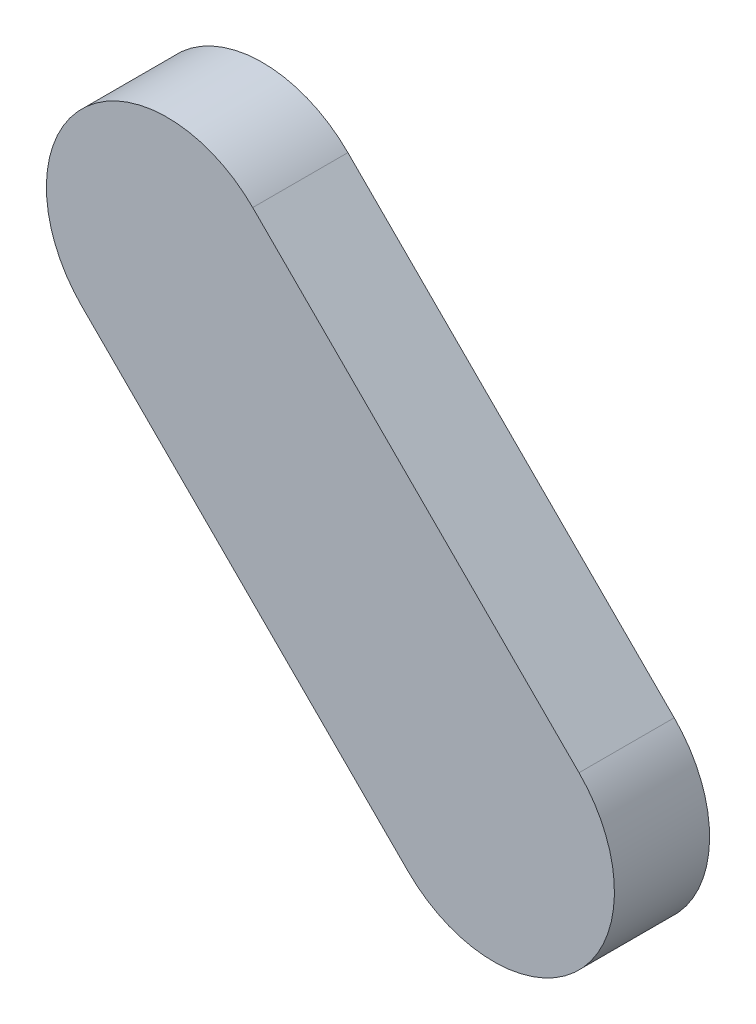
ISO-10303-21;
HEADER;
FILE_DESCRIPTION(('STEP AP214'),'2;1');
FILE_NAME('part.step','',(''),(''),'','','');
FILE_SCHEMA(('AUTOMOTIVE_DESIGN { 1 0 10303 214 1 1 1 1 }'));
ENDSEC;
DATA;
#1=APPLICATION_CONTEXT('core data for automotive mechanical design processes');
#2=APPLICATION_PROTOCOL_DEFINITION('international standard','automotive_design',2000,#1);
#3=PRODUCT_CONTEXT('',#1,'mechanical');
#4=PRODUCT('Part','Part','',(#3));
#5=PRODUCT_RELATED_PRODUCT_CATEGORY('part','',(#4));
#6=PRODUCT_DEFINITION_FORMATION('','',#4);
#7=PRODUCT_DEFINITION_CONTEXT('part definition',#1,'design');
#8=PRODUCT_DEFINITION('design','',#6,#7);
#9=PRODUCT_DEFINITION_SHAPE('','',#8);
#10=(LENGTH_UNIT() NAMED_UNIT(*) SI_UNIT(.MILLI.,.METRE.));
#11=(NAMED_UNIT(*) PLANE_ANGLE_UNIT() SI_UNIT($,.RADIAN.));
#12=(NAMED_UNIT(*) SI_UNIT($,.STERADIAN.) SOLID_ANGLE_UNIT());
#13=UNCERTAINTY_MEASURE_WITH_UNIT(LENGTH_MEASURE(1.E-05),#10,'distance_accuracy_value','');
#14=(GEOMETRIC_REPRESENTATION_CONTEXT(3) GLOBAL_UNCERTAINTY_ASSIGNED_CONTEXT((#13)) GLOBAL_UNIT_ASSIGNED_CONTEXT((#10,
#11,#12)) REPRESENTATION_CONTEXT('',''));
#15=CARTESIAN_POINT('',(0.,0.,0.));
#16=DIRECTION('',(0.,0.,1.));
#17=DIRECTION('',(1.,0.,0.));
#18=AXIS2_PLACEMENT_3D('',#15,#16,#17);
#19=CARTESIAN_POINT('',(130.50339406,78.03309006,0.));
#20=DIRECTION('',(0.707106781186548,0.707106781186548,0.));
#21=DIRECTION('',(0.707106781186548,-0.707106781186548,0.));
#22=AXIS2_PLACEMENT_3D('',#19,#20,#21);
#23=PLANE('',#22);
#24=DIRECTION('',(0.707106781186548,-0.707106781186548,0.));
#25=VECTOR('',#24,1.);
#26=CARTESIAN_POINT('',(130.50339406,78.03309006,0.1999996));
#27=LINE('',#26,#25);
#28=CARTESIAN_POINT('',(130.50339406,78.03309006,0.1999996));
#29=VERTEX_POINT('',#28);
#30=CARTESIAN_POINT('',(131.18919406,77.34729006,0.1999996));
#31=VERTEX_POINT('',#30);
#32=EDGE_CURVE('E11',#29,#31,#27,.T.);
#33=ORIENTED_EDGE('',*,*,#32,.F.);
#34=DIRECTION('',(0.,0.,1.));
#35=VECTOR('',#34,1.);
#36=CARTESIAN_POINT('',(130.50339406,78.03309006,0.));
#37=LINE('',#36,#35);
#38=CARTESIAN_POINT('',(130.50339406,78.03309006,0.));
#39=VERTEX_POINT('',#38);
#40=EDGE_CURVE('E24',#39,#29,#37,.T.);
#41=ORIENTED_EDGE('',*,*,#40,.F.);
#42=DIRECTION('',(0.707106781186548,-0.707106781186548,0.));
#43=VECTOR('',#42,1.);
#44=CARTESIAN_POINT('',(130.50339406,78.03309006,0.));
#45=LINE('',#44,#43);
#46=CARTESIAN_POINT('',(131.18919406,77.34729006,0.));
#47=VERTEX_POINT('',#46);
#48=EDGE_CURVE('E75',#39,#47,#45,.T.);
#49=ORIENTED_EDGE('',*,*,#48,.T.);
#50=DIRECTION('',(0.,0.,1.));
#51=VECTOR('',#50,1.);
#52=CARTESIAN_POINT('',(131.18919406,77.34729006,0.));
#53=LINE('',#52,#51);
#54=EDGE_CURVE('E37',#47,#31,#53,.T.);
#55=ORIENTED_EDGE('',*,*,#54,.T.);
#56=EDGE_LOOP('',(#33,#41,#49,#55));
#57=FACE_BOUND('',#56,.T.);
#58=ADVANCED_FACE('F17',(#57),#23,.F.);
#59=CARTESIAN_POINT('',(131.3688,77.526896,0.));
#60=DIRECTION('',(0.,0.,-1.));
#61=DIRECTION('',(-0.70710678118652,-0.707106781186576,0.));
#62=AXIS2_PLACEMENT_3D('',#59,#60,#61);
#63=CYLINDRICAL_SURFACE('',#62,0.254001156230774);
#64=CARTESIAN_POINT('',(131.3688,77.526896,0.1999996));
#65=DIRECTION('',(0.,0.,1.));
#66=DIRECTION('',(-0.70710678118652,-0.707106781186576,0.));
#67=AXIS2_PLACEMENT_3D('',#64,#65,#66);
#68=CIRCLE('',#67,0.254001156230774);
#69=CARTESIAN_POINT('',(131.54840594,77.70650194,0.1999996));
#70=VERTEX_POINT('',#69);
#71=EDGE_CURVE('E83',#31,#70,#68,.T.);
#72=ORIENTED_EDGE('',*,*,#71,.F.);
#73=ORIENTED_EDGE('',*,*,#54,.F.);
#74=CARTESIAN_POINT('',(131.3688,77.526896,0.));
#75=DIRECTION('',(0.,0.,1.));
#76=DIRECTION('',(-0.70710678118652,-0.707106781186576,0.));
#77=AXIS2_PLACEMENT_3D('',#74,#75,#76);
#78=CIRCLE('',#77,0.254001156230774);
#79=CARTESIAN_POINT('',(131.54840594,77.70650194,0.));
#80=VERTEX_POINT('',#79);
#81=EDGE_CURVE('E81',#47,#80,#78,.T.);
#82=ORIENTED_EDGE('',*,*,#81,.T.);
#83=DIRECTION('',(0.,0.,1.));
#84=VECTOR('',#83,1.);
#85=CARTESIAN_POINT('',(131.54840594,77.70650194,0.));
#86=LINE('',#85,#84);
#87=EDGE_CURVE('E67',#80,#70,#86,.T.);
#88=ORIENTED_EDGE('',*,*,#87,.T.);
#89=EDGE_LOOP('',(#72,#73,#82,#88));
#90=FACE_BOUND('',#89,.T.);
#91=ADVANCED_FACE('F89',(#90),#63,.T.);
#92=CARTESIAN_POINT('',(131.54840594,77.70650194,0.));
#93=DIRECTION('',(-0.707106781186548,-0.707106781186548,0.));
#94=DIRECTION('',(-0.707106781186548,0.707106781186548,0.));
#95=AXIS2_PLACEMENT_3D('',#92,#93,#94);
#96=PLANE('',#95);
#97=DIRECTION('',(-0.707106781186548,0.707106781186548,0.));
#98=VECTOR('',#97,1.);
#99=CARTESIAN_POINT('',(131.54840594,77.70650194,0.1999996));
#100=LINE('',#99,#98);
#101=CARTESIAN_POINT('',(130.86260594,78.39230194,0.1999996));
#102=VERTEX_POINT('',#101);
#103=EDGE_CURVE('E71',#70,#102,#100,.T.);
#104=ORIENTED_EDGE('',*,*,#103,.F.);
#105=ORIENTED_EDGE('',*,*,#87,.F.);
#106=DIRECTION('',(-0.707106781186548,0.707106781186548,0.));
#107=VECTOR('',#106,1.);
#108=CARTESIAN_POINT('',(131.54840594,77.70650194,0.));
#109=LINE('',#108,#107);
#110=CARTESIAN_POINT('',(130.86260594,78.39230194,0.));
#111=VERTEX_POINT('',#110);
#112=EDGE_CURVE('E63',#80,#111,#109,.T.);
#113=ORIENTED_EDGE('',*,*,#112,.T.);
#114=DIRECTION('',(0.,0.,1.));
#115=VECTOR('',#114,1.);
#116=CARTESIAN_POINT('',(130.86260594,78.39230194,0.));
#117=LINE('',#116,#115);
#118=EDGE_CURVE('E53',#111,#102,#117,.T.);
#119=ORIENTED_EDGE('',*,*,#118,.T.);
#120=EDGE_LOOP('',(#104,#105,#113,#119));
#121=FACE_BOUND('',#120,.T.);
#122=ADVANCED_FACE('F66',(#121),#96,.F.);
#123=CARTESIAN_POINT('',(130.683,78.212696,0.));
#124=DIRECTION('',(0.,0.,-1.));
#125=DIRECTION('',(0.70710678118652,0.707106781186576,0.));
#126=AXIS2_PLACEMENT_3D('',#123,#124,#125);
#127=CYLINDRICAL_SURFACE('',#126,0.254001156230774);
#128=CARTESIAN_POINT('',(130.683,78.212696,0.1999996));
#129=DIRECTION('',(0.,0.,1.));
#130=DIRECTION('',(0.70710678118652,0.707106781186576,0.));
#131=AXIS2_PLACEMENT_3D('',#128,#129,#130);
#132=CIRCLE('',#131,0.254001156230774);
#133=EDGE_CURVE('E59',#102,#29,#132,.T.);
#134=ORIENTED_EDGE('',*,*,#133,.F.);
#135=ORIENTED_EDGE('',*,*,#118,.F.);
#136=CARTESIAN_POINT('',(130.683,78.212696,0.));
#137=DIRECTION('',(0.,0.,1.));
#138=DIRECTION('',(0.70710678118652,0.707106781186576,0.));
#139=AXIS2_PLACEMENT_3D('',#136,#137,#138);
#140=CIRCLE('',#139,0.254001156230774);
#141=EDGE_CURVE('E57',#111,#39,#140,.T.);
#142=ORIENTED_EDGE('',*,*,#141,.T.);
#143=ORIENTED_EDGE('',*,*,#40,.T.);
#144=EDGE_LOOP('',(#134,#135,#142,#143));
#145=FACE_BOUND('',#144,.T.);
#146=ADVANCED_FACE('F55',(#145),#127,.T.);
#147=CARTESIAN_POINT('',(130.50339406,78.03309006,0.));
#148=DIRECTION('',(0.,0.,-1.));
#149=DIRECTION('',(-1.,0.,0.));
#150=AXIS2_PLACEMENT_3D('',#147,#148,#149);
#151=PLANE('',#150);
#152=ORIENTED_EDGE('',*,*,#141,.F.);
#153=ORIENTED_EDGE('',*,*,#112,.F.);
#154=ORIENTED_EDGE('',*,*,#81,.F.);
#155=ORIENTED_EDGE('',*,*,#48,.F.);
#156=EDGE_LOOP('',(#152,#153,#154,#155));
#157=FACE_BOUND('',#156,.T.);
#158=ADVANCED_FACE('F74',(#157),#151,.T.);
#159=CARTESIAN_POINT('',(130.50339406,78.03309006,0.1999996));
#160=DIRECTION('',(0.,0.,-1.));
#161=DIRECTION('',(-1.,0.,0.));
#162=AXIS2_PLACEMENT_3D('',#159,#160,#161);
#163=PLANE('',#162);
#164=ORIENTED_EDGE('',*,*,#32,.T.);
#165=ORIENTED_EDGE('',*,*,#71,.T.);
#166=ORIENTED_EDGE('',*,*,#103,.T.);
#167=ORIENTED_EDGE('',*,*,#133,.T.);
#168=EDGE_LOOP('',(#164,#165,#166,#167));
#169=FACE_BOUND('',#168,.T.);
#170=ADVANCED_FACE('F91',(#169),#163,.F.);
#171=CLOSED_SHELL('',(#58,#91,#122,#146,#158,#170));
#172=MANIFOLD_SOLID_BREP('B1',#171);
#173=ADVANCED_BREP_SHAPE_REPRESENTATION('',(#18,#172),#14);
#174=SHAPE_DEFINITION_REPRESENTATION(#9,#173);
ENDSEC;
END-ISO-10303-21;
